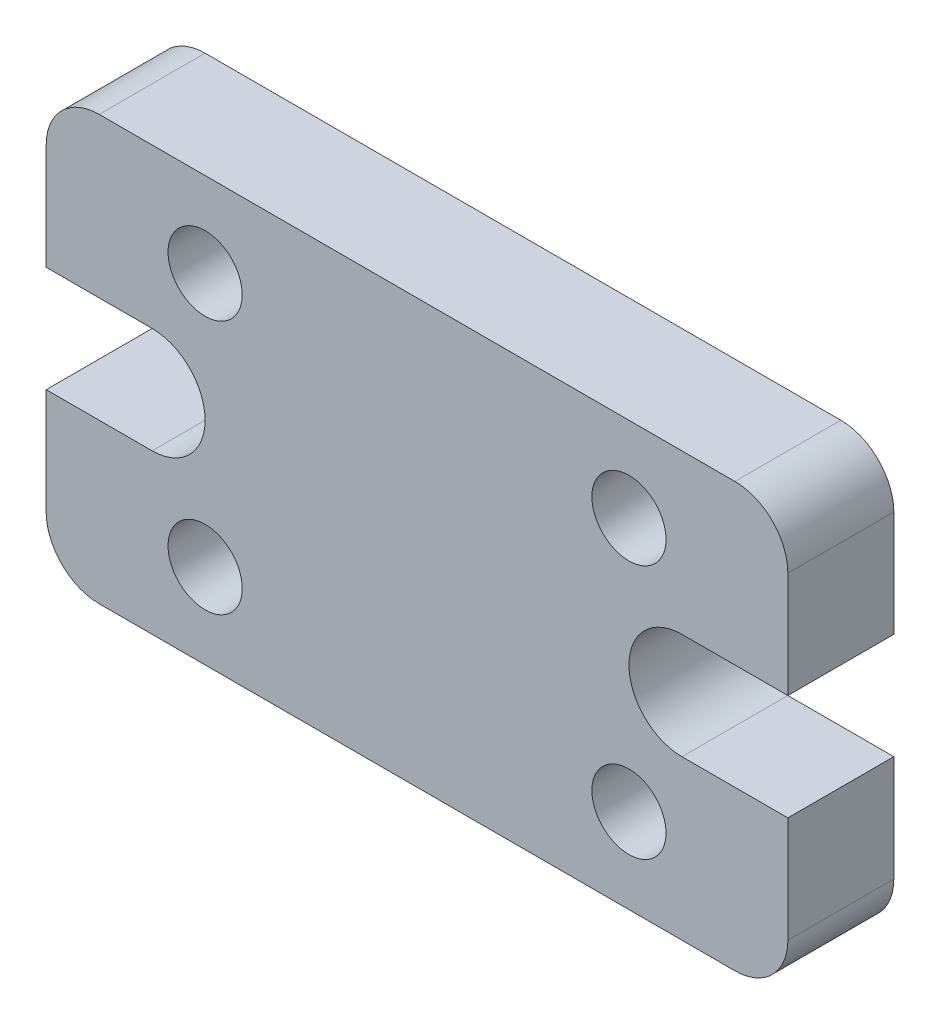
ISO-10303-21;
HEADER;
FILE_DESCRIPTION(('STEP AP214'),'2;1');
FILE_NAME('part.step','',(''),(''),'','','');
FILE_SCHEMA(('AUTOMOTIVE_DESIGN { 1 0 10303 214 1 1 1 1 }'));
ENDSEC;
DATA;
#1=APPLICATION_CONTEXT('core data for automotive mechanical design processes');
#2=APPLICATION_PROTOCOL_DEFINITION('international standard','automotive_design',2000,#1);
#3=PRODUCT_CONTEXT('',#1,'mechanical');
#4=PRODUCT('Part','Part','',(#3));
#5=PRODUCT_RELATED_PRODUCT_CATEGORY('part','',(#4));
#6=PRODUCT_DEFINITION_FORMATION('','',#4);
#7=PRODUCT_DEFINITION_CONTEXT('part definition',#1,'design');
#8=PRODUCT_DEFINITION('design','',#6,#7);
#9=PRODUCT_DEFINITION_SHAPE('','',#8);
#10=(LENGTH_UNIT() NAMED_UNIT(*) SI_UNIT(.MILLI.,.METRE.));
#11=(NAMED_UNIT(*) PLANE_ANGLE_UNIT() SI_UNIT($,.RADIAN.));
#12=(NAMED_UNIT(*) SI_UNIT($,.STERADIAN.) SOLID_ANGLE_UNIT());
#13=UNCERTAINTY_MEASURE_WITH_UNIT(LENGTH_MEASURE(1.E-05),#10,'distance_accuracy_value','');
#14=(GEOMETRIC_REPRESENTATION_CONTEXT(3) GLOBAL_UNCERTAINTY_ASSIGNED_CONTEXT((#13)) GLOBAL_UNIT_ASSIGNED_CONTEXT((#10,
#11,#12)) REPRESENTATION_CONTEXT('',''));
#15=CARTESIAN_POINT('',(0.,0.,0.));
#16=DIRECTION('',(0.,0.,1.));
#17=DIRECTION('',(1.,0.,0.));
#18=AXIS2_PLACEMENT_3D('',#15,#16,#17);
#19=CARTESIAN_POINT('',(30.,15.,10.));
#20=DIRECTION('',(0.,0.,-1.));
#21=DIRECTION('',(-1.,0.,0.));
#22=AXIS2_PLACEMENT_3D('',#19,#20,#21);
#23=PLANE('',#22);
#24=CARTESIAN_POINT('',(30.,15.,10.));
#25=DIRECTION('',(0.,0.,1.));
#26=DIRECTION('',(-1.,0.,0.));
#27=AXIS2_PLACEMENT_3D('',#24,#25,#26);
#28=CIRCLE('',#27,5.);
#29=CARTESIAN_POINT('',(35.,15.,10.));
#30=VERTEX_POINT('',#29);
#31=CARTESIAN_POINT('',(30.,20.,10.));
#32=VERTEX_POINT('',#31);
#33=EDGE_CURVE('E212',#30,#32,#28,.T.);
#34=ORIENTED_EDGE('',*,*,#33,.T.);
#35=DIRECTION('',(-1.,0.,0.));
#36=VECTOR('',#35,1.);
#37=CARTESIAN_POINT('',(-30.,20.,10.));
#38=LINE('',#37,#36);
#39=CARTESIAN_POINT('',(-30.,20.,10.));
#40=VERTEX_POINT('',#39);
#41=EDGE_CURVE('E120',#32,#40,#38,.T.);
#42=ORIENTED_EDGE('',*,*,#41,.T.);
#43=CARTESIAN_POINT('',(-30.,15.,10.));
#44=DIRECTION('',(0.,0.,1.));
#45=DIRECTION('',(1.,0.,0.));
#46=AXIS2_PLACEMENT_3D('',#43,#44,#45);
#47=CIRCLE('',#46,5.);
#48=CARTESIAN_POINT('',(-35.,15.,10.));
#49=VERTEX_POINT('',#48);
#50=EDGE_CURVE('E251',#40,#49,#47,.T.);
#51=ORIENTED_EDGE('',*,*,#50,.T.);
#52=DIRECTION('',(0.,-1.,0.));
#53=VECTOR('',#52,1.);
#54=CARTESIAN_POINT('',(-35.,15.,10.));
#55=LINE('',#54,#53);
#56=CARTESIAN_POINT('',(-35.,5.,10.));
#57=VERTEX_POINT('',#56);
#58=EDGE_CURVE('E270',#49,#57,#55,.T.);
#59=ORIENTED_EDGE('',*,*,#58,.T.);
#60=DIRECTION('',(1.,0.,0.));
#61=VECTOR('',#60,1.);
#62=CARTESIAN_POINT('',(-35.,5.,10.));
#63=LINE('',#62,#61);
#64=CARTESIAN_POINT('',(-25.,5.,10.));
#65=VERTEX_POINT('',#64);
#66=EDGE_CURVE('E267',#57,#65,#63,.T.);
#67=ORIENTED_EDGE('',*,*,#66,.T.);
#68=CARTESIAN_POINT('',(-25.,0.,10.));
#69=DIRECTION('',(0.,0.,-1.));
#70=DIRECTION('',(-1.,0.,0.));
#71=AXIS2_PLACEMENT_3D('',#68,#69,#70);
#72=CIRCLE('',#71,5.00000000000001);
#73=CARTESIAN_POINT('',(-25.,-5.00000000000001,10.));
#74=VERTEX_POINT('',#73);
#75=EDGE_CURVE('E269',#65,#74,#72,.T.);
#76=ORIENTED_EDGE('',*,*,#75,.T.);
#77=DIRECTION('',(-1.,0.,0.));
#78=VECTOR('',#77,1.);
#79=CARTESIAN_POINT('',(-35.,-5.00000000000001,10.));
#80=LINE('',#79,#78);
#81=CARTESIAN_POINT('',(-35.,-5.00000000000001,10.));
#82=VERTEX_POINT('',#81);
#83=EDGE_CURVE('E272',#74,#82,#80,.T.);
#84=ORIENTED_EDGE('',*,*,#83,.T.);
#85=DIRECTION('',(0.,-1.,0.));
#86=VECTOR('',#85,1.);
#87=CARTESIAN_POINT('',(-35.,-15.,10.));
#88=LINE('',#87,#86);
#89=CARTESIAN_POINT('',(-35.,-15.,10.));
#90=VERTEX_POINT('',#89);
#91=EDGE_CURVE('E278',#82,#90,#88,.T.);
#92=ORIENTED_EDGE('',*,*,#91,.T.);
#93=CARTESIAN_POINT('',(-30.,-15.,10.));
#94=DIRECTION('',(0.,0.,1.));
#95=DIRECTION('',(-1.,0.,0.));
#96=AXIS2_PLACEMENT_3D('',#93,#94,#95);
#97=CIRCLE('',#96,5.);
#98=CARTESIAN_POINT('',(-30.,-20.,10.));
#99=VERTEX_POINT('',#98);
#100=EDGE_CURVE('E280',#90,#99,#97,.T.);
#101=ORIENTED_EDGE('',*,*,#100,.T.);
#102=DIRECTION('',(1.,0.,0.));
#103=VECTOR('',#102,1.);
#104=CARTESIAN_POINT('',(-30.,-20.,10.));
#105=LINE('',#104,#103);
#106=CARTESIAN_POINT('',(30.,-20.,10.));
#107=VERTEX_POINT('',#106);
#108=EDGE_CURVE('E282',#99,#107,#105,.T.);
#109=ORIENTED_EDGE('',*,*,#108,.T.);
#110=CARTESIAN_POINT('',(30.,-15.,10.));
#111=DIRECTION('',(0.,0.,1.));
#112=DIRECTION('',(1.,0.,0.));
#113=AXIS2_PLACEMENT_3D('',#110,#111,#112);
#114=CIRCLE('',#113,5.);
#115=CARTESIAN_POINT('',(35.,-15.,10.));
#116=VERTEX_POINT('',#115);
#117=EDGE_CURVE('E284',#107,#116,#114,.T.);
#118=ORIENTED_EDGE('',*,*,#117,.T.);
#119=DIRECTION('',(0.,1.,0.));
#120=VECTOR('',#119,1.);
#121=CARTESIAN_POINT('',(35.,-15.,10.));
#122=LINE('',#121,#120);
#123=CARTESIAN_POINT('',(35.,-5.,10.));
#124=VERTEX_POINT('',#123);
#125=EDGE_CURVE('E286',#116,#124,#122,.T.);
#126=ORIENTED_EDGE('',*,*,#125,.T.);
#127=DIRECTION('',(-1.,0.,0.));
#128=VECTOR('',#127,1.);
#129=CARTESIAN_POINT('',(35.,-5.,10.));
#130=LINE('',#129,#128);
#131=CARTESIAN_POINT('',(25.,-5.00000000000001,10.));
#132=VERTEX_POINT('',#131);
#133=EDGE_CURVE('E163',#124,#132,#130,.T.);
#134=ORIENTED_EDGE('',*,*,#133,.T.);
#135=CARTESIAN_POINT('',(25.,0.,10.));
#136=DIRECTION('',(0.,0.,-1.));
#137=DIRECTION('',(1.,0.,0.));
#138=AXIS2_PLACEMENT_3D('',#135,#136,#137);
#139=CIRCLE('',#138,5.00000000000001);
#140=CARTESIAN_POINT('',(25.,5.00000000000001,10.));
#141=VERTEX_POINT('',#140);
#142=EDGE_CURVE('E157',#132,#141,#139,.T.);
#143=ORIENTED_EDGE('',*,*,#142,.T.);
#144=DIRECTION('',(1.,0.,0.));
#145=VECTOR('',#144,1.);
#146=CARTESIAN_POINT('',(35.,5.,10.));
#147=LINE('',#146,#145);
#148=CARTESIAN_POINT('',(35.,5.,10.));
#149=VERTEX_POINT('',#148);
#150=EDGE_CURVE('E161',#141,#149,#147,.T.);
#151=ORIENTED_EDGE('',*,*,#150,.T.);
#152=DIRECTION('',(0.,1.,0.));
#153=VECTOR('',#152,1.);
#154=CARTESIAN_POINT('',(35.,15.,10.));
#155=LINE('',#154,#153);
#156=EDGE_CURVE('E53',#149,#30,#155,.T.);
#157=ORIENTED_EDGE('',*,*,#156,.T.);
#158=EDGE_LOOP('',(#34,#42,#51,#59,#67,#76,#84,#92,#101,#109,#118,#126,#134,#143,#151,#157));
#159=FACE_BOUND('',#158,.T.);
#160=CARTESIAN_POINT('',(20.,12.,10.));
#161=DIRECTION('',(0.,0.,1.));
#162=DIRECTION('',(1.,0.,0.));
#163=AXIS2_PLACEMENT_3D('',#160,#161,#162);
#164=CIRCLE('',#163,3.5);
#165=CARTESIAN_POINT('',(23.5,12.,10.));
#166=VERTEX_POINT('',#165);
#167=EDGE_CURVE('E185',#166,#166,#164,.T.);
#168=ORIENTED_EDGE('',*,*,#167,.F.);
#169=EDGE_LOOP('',(#168));
#170=FACE_BOUND('',#169,.T.);
#171=CARTESIAN_POINT('',(20.,-12.,10.));
#172=DIRECTION('',(0.,0.,1.));
#173=DIRECTION('',(-1.,0.,0.));
#174=AXIS2_PLACEMENT_3D('',#171,#172,#173);
#175=CIRCLE('',#174,3.5);
#176=CARTESIAN_POINT('',(16.5,-12.,10.));
#177=VERTEX_POINT('',#176);
#178=EDGE_CURVE('E350',#177,#177,#175,.T.);
#179=ORIENTED_EDGE('',*,*,#178,.F.);
#180=EDGE_LOOP('',(#179));
#181=FACE_BOUND('',#180,.T.);
#182=CARTESIAN_POINT('',(-20.,-12.,10.));
#183=DIRECTION('',(0.,0.,1.));
#184=DIRECTION('',(1.,0.,0.));
#185=AXIS2_PLACEMENT_3D('',#182,#183,#184);
#186=CIRCLE('',#185,3.5);
#187=CARTESIAN_POINT('',(-16.5,-12.,10.));
#188=VERTEX_POINT('',#187);
#189=EDGE_CURVE('E344',#188,#188,#186,.T.);
#190=ORIENTED_EDGE('',*,*,#189,.F.);
#191=EDGE_LOOP('',(#190));
#192=FACE_BOUND('',#191,.T.);
#193=CARTESIAN_POINT('',(-20.,12.,10.));
#194=DIRECTION('',(0.,0.,1.));
#195=DIRECTION('',(-1.,0.,0.));
#196=AXIS2_PLACEMENT_3D('',#193,#194,#195);
#197=CIRCLE('',#196,3.5);
#198=CARTESIAN_POINT('',(-23.5,12.,10.));
#199=VERTEX_POINT('',#198);
#200=EDGE_CURVE('E335',#199,#199,#197,.T.);
#201=ORIENTED_EDGE('',*,*,#200,.F.);
#202=EDGE_LOOP('',(#201));
#203=FACE_BOUND('',#202,.T.);
#204=ADVANCED_FACE('F36',(#159,#170,#181,#192,#203),#23,.F.);
#205=CARTESIAN_POINT('',(30.,15.,0.));
#206=DIRECTION('',(0.,0.,-1.));
#207=DIRECTION('',(-1.,0.,0.));
#208=AXIS2_PLACEMENT_3D('',#205,#206,#207);
#209=PLANE('',#208);
#210=CARTESIAN_POINT('',(-20.,-12.,0.));
#211=DIRECTION('',(0.,0.,1.));
#212=DIRECTION('',(1.,0.,0.));
#213=AXIS2_PLACEMENT_3D('',#210,#211,#212);
#214=CIRCLE('',#213,3.5);
#215=CARTESIAN_POINT('',(-16.5,-12.,0.));
#216=VERTEX_POINT('',#215);
#217=EDGE_CURVE('E341',#216,#216,#214,.T.);
#218=ORIENTED_EDGE('',*,*,#217,.T.);
#219=EDGE_LOOP('',(#218));
#220=FACE_BOUND('',#219,.T.);
#221=CARTESIAN_POINT('',(20.,12.,0.));
#222=DIRECTION('',(0.,0.,1.));
#223=DIRECTION('',(1.,0.,0.));
#224=AXIS2_PLACEMENT_3D('',#221,#222,#223);
#225=CIRCLE('',#224,3.5);
#226=CARTESIAN_POINT('',(23.5,12.,0.));
#227=VERTEX_POINT('',#226);
#228=EDGE_CURVE('E353',#227,#227,#225,.T.);
#229=ORIENTED_EDGE('',*,*,#228,.T.);
#230=EDGE_LOOP('',(#229));
#231=FACE_BOUND('',#230,.T.);
#232=CARTESIAN_POINT('',(30.,15.,0.));
#233=DIRECTION('',(0.,0.,1.));
#234=DIRECTION('',(-1.,0.,0.));
#235=AXIS2_PLACEMENT_3D('',#232,#233,#234);
#236=CIRCLE('',#235,5.);
#237=CARTESIAN_POINT('',(35.,15.,0.));
#238=VERTEX_POINT('',#237);
#239=CARTESIAN_POINT('',(30.,20.,0.));
#240=VERTEX_POINT('',#239);
#241=EDGE_CURVE('E181',#238,#240,#236,.T.);
#242=ORIENTED_EDGE('',*,*,#241,.F.);
#243=DIRECTION('',(0.,1.,0.));
#244=VECTOR('',#243,1.);
#245=CARTESIAN_POINT('',(35.,15.,0.));
#246=LINE('',#245,#244);
#247=CARTESIAN_POINT('',(35.,5.,0.));
#248=VERTEX_POINT('',#247);
#249=EDGE_CURVE('E112',#248,#238,#246,.T.);
#250=ORIENTED_EDGE('',*,*,#249,.F.);
#251=DIRECTION('',(1.,0.,0.));
#252=VECTOR('',#251,1.);
#253=CARTESIAN_POINT('',(35.,5.,0.));
#254=LINE('',#253,#252);
#255=CARTESIAN_POINT('',(25.,5.00000000000001,0.));
#256=VERTEX_POINT('',#255);
#257=EDGE_CURVE('E106',#256,#248,#254,.T.);
#258=ORIENTED_EDGE('',*,*,#257,.F.);
#259=CARTESIAN_POINT('',(25.,0.,0.));
#260=DIRECTION('',(0.,0.,-1.));
#261=DIRECTION('',(1.,0.,0.));
#262=AXIS2_PLACEMENT_3D('',#259,#260,#261);
#263=CIRCLE('',#262,5.00000000000001);
#264=CARTESIAN_POINT('',(25.,-5.00000000000001,0.));
#265=VERTEX_POINT('',#264);
#266=EDGE_CURVE('E171',#265,#256,#263,.T.);
#267=ORIENTED_EDGE('',*,*,#266,.F.);
#268=DIRECTION('',(-1.,0.,0.));
#269=VECTOR('',#268,1.);
#270=CARTESIAN_POINT('',(35.,-5.,0.));
#271=LINE('',#270,#269);
#272=CARTESIAN_POINT('',(35.,-5.,0.));
#273=VERTEX_POINT('',#272);
#274=EDGE_CURVE('E207',#273,#265,#271,.T.);
#275=ORIENTED_EDGE('',*,*,#274,.F.);
#276=DIRECTION('',(0.,1.,0.));
#277=VECTOR('',#276,1.);
#278=CARTESIAN_POINT('',(35.,-15.,0.));
#279=LINE('',#278,#277);
#280=CARTESIAN_POINT('',(35.,-15.,0.));
#281=VERTEX_POINT('',#280);
#282=EDGE_CURVE('E205',#281,#273,#279,.T.);
#283=ORIENTED_EDGE('',*,*,#282,.F.);
#284=CARTESIAN_POINT('',(30.,-15.,0.));
#285=DIRECTION('',(0.,0.,1.));
#286=DIRECTION('',(1.,0.,0.));
#287=AXIS2_PLACEMENT_3D('',#284,#285,#286);
#288=CIRCLE('',#287,5.);
#289=CARTESIAN_POINT('',(30.,-20.,0.));
#290=VERTEX_POINT('',#289);
#291=EDGE_CURVE('E203',#290,#281,#288,.T.);
#292=ORIENTED_EDGE('',*,*,#291,.F.);
#293=DIRECTION('',(1.,0.,0.));
#294=VECTOR('',#293,1.);
#295=CARTESIAN_POINT('',(-30.,-20.,0.));
#296=LINE('',#295,#294);
#297=CARTESIAN_POINT('',(-30.,-20.,0.));
#298=VERTEX_POINT('',#297);
#299=EDGE_CURVE('E201',#298,#290,#296,.T.);
#300=ORIENTED_EDGE('',*,*,#299,.F.);
#301=CARTESIAN_POINT('',(-30.,-15.,0.));
#302=DIRECTION('',(0.,0.,1.));
#303=DIRECTION('',(-1.,0.,0.));
#304=AXIS2_PLACEMENT_3D('',#301,#302,#303);
#305=CIRCLE('',#304,5.);
#306=CARTESIAN_POINT('',(-35.,-15.,0.));
#307=VERTEX_POINT('',#306);
#308=EDGE_CURVE('E199',#307,#298,#305,.T.);
#309=ORIENTED_EDGE('',*,*,#308,.F.);
#310=DIRECTION('',(0.,-1.,0.));
#311=VECTOR('',#310,1.);
#312=CARTESIAN_POINT('',(-35.,-15.,0.));
#313=LINE('',#312,#311);
#314=CARTESIAN_POINT('',(-35.,-5.00000000000001,0.));
#315=VERTEX_POINT('',#314);
#316=EDGE_CURVE('E197',#315,#307,#313,.T.);
#317=ORIENTED_EDGE('',*,*,#316,.F.);
#318=DIRECTION('',(-1.,0.,0.));
#319=VECTOR('',#318,1.);
#320=CARTESIAN_POINT('',(-35.,-5.00000000000001,0.));
#321=LINE('',#320,#319);
#322=CARTESIAN_POINT('',(-25.,-5.00000000000001,0.));
#323=VERTEX_POINT('',#322);
#324=EDGE_CURVE('E195',#323,#315,#321,.T.);
#325=ORIENTED_EDGE('',*,*,#324,.F.);
#326=CARTESIAN_POINT('',(-25.,0.,0.));
#327=DIRECTION('',(0.,0.,-1.));
#328=DIRECTION('',(-1.,0.,0.));
#329=AXIS2_PLACEMENT_3D('',#326,#327,#328);
#330=CIRCLE('',#329,5.00000000000001);
#331=CARTESIAN_POINT('',(-25.,5.,0.));
#332=VERTEX_POINT('',#331);
#333=EDGE_CURVE('E193',#332,#323,#330,.T.);
#334=ORIENTED_EDGE('',*,*,#333,.F.);
#335=DIRECTION('',(1.,0.,0.));
#336=VECTOR('',#335,1.);
#337=CARTESIAN_POINT('',(-35.,5.,0.));
#338=LINE('',#337,#336);
#339=CARTESIAN_POINT('',(-35.,5.,0.));
#340=VERTEX_POINT('',#339);
#341=EDGE_CURVE('E191',#340,#332,#338,.T.);
#342=ORIENTED_EDGE('',*,*,#341,.F.);
#343=DIRECTION('',(0.,-1.,0.));
#344=VECTOR('',#343,1.);
#345=CARTESIAN_POINT('',(-35.,15.,0.));
#346=LINE('',#345,#344);
#347=CARTESIAN_POINT('',(-35.,15.,0.));
#348=VERTEX_POINT('',#347);
#349=EDGE_CURVE('E189',#348,#340,#346,.T.);
#350=ORIENTED_EDGE('',*,*,#349,.F.);
#351=CARTESIAN_POINT('',(-30.,15.,0.));
#352=DIRECTION('',(0.,0.,1.));
#353=DIRECTION('',(1.,0.,0.));
#354=AXIS2_PLACEMENT_3D('',#351,#352,#353);
#355=CIRCLE('',#354,5.);
#356=CARTESIAN_POINT('',(-30.,20.,0.));
#357=VERTEX_POINT('',#356);
#358=EDGE_CURVE('E187',#357,#348,#355,.T.);
#359=ORIENTED_EDGE('',*,*,#358,.F.);
#360=DIRECTION('',(-1.,0.,0.));
#361=VECTOR('',#360,1.);
#362=CARTESIAN_POINT('',(-30.,20.,0.));
#363=LINE('',#362,#361);
#364=EDGE_CURVE('E184',#240,#357,#363,.T.);
#365=ORIENTED_EDGE('',*,*,#364,.F.);
#366=EDGE_LOOP('',(#242,#250,#258,#267,#275,#283,#292,#300,#309,#317,#325,#334,#342,#350,#359,#365));
#367=FACE_BOUND('',#366,.T.);
#368=CARTESIAN_POINT('',(20.,-12.,0.));
#369=DIRECTION('',(0.,0.,1.));
#370=DIRECTION('',(-1.,0.,0.));
#371=AXIS2_PLACEMENT_3D('',#368,#369,#370);
#372=CIRCLE('',#371,3.5);
#373=CARTESIAN_POINT('',(16.5,-12.,0.));
#374=VERTEX_POINT('',#373);
#375=EDGE_CURVE('E347',#374,#374,#372,.T.);
#376=ORIENTED_EDGE('',*,*,#375,.T.);
#377=EDGE_LOOP('',(#376));
#378=FACE_BOUND('',#377,.T.);
#379=CARTESIAN_POINT('',(-20.,12.,0.));
#380=DIRECTION('',(0.,0.,1.));
#381=DIRECTION('',(-1.,0.,0.));
#382=AXIS2_PLACEMENT_3D('',#379,#380,#381);
#383=CIRCLE('',#382,3.5);
#384=CARTESIAN_POINT('',(-23.5,12.,0.));
#385=VERTEX_POINT('',#384);
#386=EDGE_CURVE('E338',#385,#385,#383,.T.);
#387=ORIENTED_EDGE('',*,*,#386,.T.);
#388=EDGE_LOOP('',(#387));
#389=FACE_BOUND('',#388,.T.);
#390=ADVANCED_FACE('F255',(#220,#231,#367,#378,#389),#209,.T.);
#391=CARTESIAN_POINT('',(30.,15.,10.));
#392=DIRECTION('',(0.,0.,-1.));
#393=DIRECTION('',(-1.,0.,0.));
#394=AXIS2_PLACEMENT_3D('',#391,#392,#393);
#395=CYLINDRICAL_SURFACE('',#394,5.);
#396=ORIENTED_EDGE('',*,*,#241,.T.);
#397=DIRECTION('',(0.,0.,-1.));
#398=VECTOR('',#397,1.);
#399=CARTESIAN_POINT('',(30.,20.,10.));
#400=LINE('',#399,#398);
#401=EDGE_CURVE('E11',#32,#240,#400,.T.);
#402=ORIENTED_EDGE('',*,*,#401,.F.);
#403=ORIENTED_EDGE('',*,*,#33,.F.);
#404=DIRECTION('',(0.,0.,-1.));
#405=VECTOR('',#404,1.);
#406=CARTESIAN_POINT('',(35.,15.,10.));
#407=LINE('',#406,#405);
#408=EDGE_CURVE('E177',#30,#238,#407,.T.);
#409=ORIENTED_EDGE('',*,*,#408,.T.);
#410=EDGE_LOOP('',(#396,#402,#403,#409));
#411=FACE_BOUND('',#410,.T.);
#412=ADVANCED_FACE('F38',(#411),#395,.T.);
#413=CARTESIAN_POINT('',(-30.,20.,10.));
#414=DIRECTION('',(0.,-1.,0.));
#415=DIRECTION('',(1.,0.,0.));
#416=AXIS2_PLACEMENT_3D('',#413,#414,#415);
#417=PLANE('',#416);
#418=ORIENTED_EDGE('',*,*,#364,.T.);
#419=DIRECTION('',(0.,0.,-1.));
#420=VECTOR('',#419,1.);
#421=CARTESIAN_POINT('',(-30.,20.,10.));
#422=LINE('',#421,#420);
#423=EDGE_CURVE('E45',#40,#357,#422,.T.);
#424=ORIENTED_EDGE('',*,*,#423,.F.);
#425=ORIENTED_EDGE('',*,*,#41,.F.);
#426=ORIENTED_EDGE('',*,*,#401,.T.);
#427=EDGE_LOOP('',(#418,#424,#425,#426));
#428=FACE_BOUND('',#427,.T.);
#429=ADVANCED_FACE('F505',(#428),#417,.F.);
#430=CARTESIAN_POINT('',(-30.,15.,10.));
#431=DIRECTION('',(0.,0.,-1.));
#432=DIRECTION('',(-1.,0.,0.));
#433=AXIS2_PLACEMENT_3D('',#430,#431,#432);
#434=CYLINDRICAL_SURFACE('',#433,5.);
#435=ORIENTED_EDGE('',*,*,#358,.T.);
#436=DIRECTION('',(0.,0.,-1.));
#437=VECTOR('',#436,1.);
#438=CARTESIAN_POINT('',(-35.,15.,10.));
#439=LINE('',#438,#437);
#440=EDGE_CURVE('E243',#49,#348,#439,.T.);
#441=ORIENTED_EDGE('',*,*,#440,.F.);
#442=ORIENTED_EDGE('',*,*,#50,.F.);
#443=ORIENTED_EDGE('',*,*,#423,.T.);
#444=EDGE_LOOP('',(#435,#441,#442,#443));
#445=FACE_BOUND('',#444,.T.);
#446=ADVANCED_FACE('F249',(#445),#434,.T.);
#447=CARTESIAN_POINT('',(-35.,15.,10.));
#448=DIRECTION('',(1.,0.,0.));
#449=DIRECTION('',(0.,1.,0.));
#450=AXIS2_PLACEMENT_3D('',#447,#448,#449);
#451=PLANE('',#450);
#452=ORIENTED_EDGE('',*,*,#349,.T.);
#453=DIRECTION('',(0.,0.,-1.));
#454=VECTOR('',#453,1.);
#455=CARTESIAN_POINT('',(-35.,5.,10.));
#456=LINE('',#455,#454);
#457=EDGE_CURVE('E240',#57,#340,#456,.T.);
#458=ORIENTED_EDGE('',*,*,#457,.F.);
#459=ORIENTED_EDGE('',*,*,#58,.F.);
#460=ORIENTED_EDGE('',*,*,#440,.T.);
#461=EDGE_LOOP('',(#452,#458,#459,#460));
#462=FACE_BOUND('',#461,.T.);
#463=ADVANCED_FACE('F261',(#462),#451,.F.);
#464=CARTESIAN_POINT('',(-35.,5.,10.));
#465=DIRECTION('',(0.,1.,0.));
#466=DIRECTION('',(-1.,0.,0.));
#467=AXIS2_PLACEMENT_3D('',#464,#465,#466);
#468=PLANE('',#467);
#469=ORIENTED_EDGE('',*,*,#341,.T.);
#470=DIRECTION('',(0.,0.,-1.));
#471=VECTOR('',#470,1.);
#472=CARTESIAN_POINT('',(-25.,5.,10.));
#473=LINE('',#472,#471);
#474=EDGE_CURVE('E237',#65,#332,#473,.T.);
#475=ORIENTED_EDGE('',*,*,#474,.F.);
#476=ORIENTED_EDGE('',*,*,#66,.F.);
#477=ORIENTED_EDGE('',*,*,#457,.T.);
#478=EDGE_LOOP('',(#469,#475,#476,#477));
#479=FACE_BOUND('',#478,.T.);
#480=ADVANCED_FACE('F265',(#479),#468,.F.);
#481=CARTESIAN_POINT('',(-25.,0.,10.));
#482=DIRECTION('',(0.,0.,-1.));
#483=DIRECTION('',(-1.,0.,0.));
#484=AXIS2_PLACEMENT_3D('',#481,#482,#483);
#485=CYLINDRICAL_SURFACE('',#484,5.00000000000001);
#486=ORIENTED_EDGE('',*,*,#333,.T.);
#487=DIRECTION('',(0.,0.,-1.));
#488=VECTOR('',#487,1.);
#489=CARTESIAN_POINT('',(-25.,-5.00000000000001,10.));
#490=LINE('',#489,#488);
#491=EDGE_CURVE('E234',#74,#323,#490,.T.);
#492=ORIENTED_EDGE('',*,*,#491,.F.);
#493=ORIENTED_EDGE('',*,*,#75,.F.);
#494=ORIENTED_EDGE('',*,*,#474,.T.);
#495=EDGE_LOOP('',(#486,#492,#493,#494));
#496=FACE_BOUND('',#495,.T.);
#497=ADVANCED_FACE('F470',(#496),#485,.F.);
#498=CARTESIAN_POINT('',(-35.,-5.00000000000001,10.));
#499=DIRECTION('',(0.,-1.,0.));
#500=DIRECTION('',(1.,0.,0.));
#501=AXIS2_PLACEMENT_3D('',#498,#499,#500);
#502=PLANE('',#501);
#503=ORIENTED_EDGE('',*,*,#324,.T.);
#504=DIRECTION('',(0.,0.,-1.));
#505=VECTOR('',#504,1.);
#506=CARTESIAN_POINT('',(-35.,-5.00000000000001,10.));
#507=LINE('',#506,#505);
#508=EDGE_CURVE('E231',#82,#315,#507,.T.);
#509=ORIENTED_EDGE('',*,*,#508,.F.);
#510=ORIENTED_EDGE('',*,*,#83,.F.);
#511=ORIENTED_EDGE('',*,*,#491,.T.);
#512=EDGE_LOOP('',(#503,#509,#510,#511));
#513=FACE_BOUND('',#512,.T.);
#514=ADVANCED_FACE('F460',(#513),#502,.F.);
#515=CARTESIAN_POINT('',(-35.,-15.,10.));
#516=DIRECTION('',(1.,0.,0.));
#517=DIRECTION('',(0.,1.,0.));
#518=AXIS2_PLACEMENT_3D('',#515,#516,#517);
#519=PLANE('',#518);
#520=ORIENTED_EDGE('',*,*,#316,.T.);
#521=DIRECTION('',(0.,0.,-1.));
#522=VECTOR('',#521,1.);
#523=CARTESIAN_POINT('',(-35.,-15.,10.));
#524=LINE('',#523,#522);
#525=EDGE_CURVE('E228',#90,#307,#524,.T.);
#526=ORIENTED_EDGE('',*,*,#525,.F.);
#527=ORIENTED_EDGE('',*,*,#91,.F.);
#528=ORIENTED_EDGE('',*,*,#508,.T.);
#529=EDGE_LOOP('',(#520,#526,#527,#528));
#530=FACE_BOUND('',#529,.T.);
#531=ADVANCED_FACE('F450',(#530),#519,.F.);
#532=CARTESIAN_POINT('',(-30.,-15.,10.));
#533=DIRECTION('',(0.,0.,-1.));
#534=DIRECTION('',(-1.,0.,0.));
#535=AXIS2_PLACEMENT_3D('',#532,#533,#534);
#536=CYLINDRICAL_SURFACE('',#535,5.);
#537=ORIENTED_EDGE('',*,*,#308,.T.);
#538=DIRECTION('',(0.,0.,-1.));
#539=VECTOR('',#538,1.);
#540=CARTESIAN_POINT('',(-30.,-20.,10.));
#541=LINE('',#540,#539);
#542=EDGE_CURVE('E225',#99,#298,#541,.T.);
#543=ORIENTED_EDGE('',*,*,#542,.F.);
#544=ORIENTED_EDGE('',*,*,#100,.F.);
#545=ORIENTED_EDGE('',*,*,#525,.T.);
#546=EDGE_LOOP('',(#537,#543,#544,#545));
#547=FACE_BOUND('',#546,.T.);
#548=ADVANCED_FACE('F440',(#547),#536,.T.);
#549=CARTESIAN_POINT('',(-30.,-20.,10.));
#550=DIRECTION('',(0.,1.,0.));
#551=DIRECTION('',(-1.,0.,0.));
#552=AXIS2_PLACEMENT_3D('',#549,#550,#551);
#553=PLANE('',#552);
#554=ORIENTED_EDGE('',*,*,#299,.T.);
#555=DIRECTION('',(0.,0.,-1.));
#556=VECTOR('',#555,1.);
#557=CARTESIAN_POINT('',(30.,-20.,10.));
#558=LINE('',#557,#556);
#559=EDGE_CURVE('E222',#107,#290,#558,.T.);
#560=ORIENTED_EDGE('',*,*,#559,.F.);
#561=ORIENTED_EDGE('',*,*,#108,.F.);
#562=ORIENTED_EDGE('',*,*,#542,.T.);
#563=EDGE_LOOP('',(#554,#560,#561,#562));
#564=FACE_BOUND('',#563,.T.);
#565=ADVANCED_FACE('F430',(#564),#553,.F.);
#566=CARTESIAN_POINT('',(30.,-15.,10.));
#567=DIRECTION('',(0.,0.,-1.));
#568=DIRECTION('',(-1.,0.,0.));
#569=AXIS2_PLACEMENT_3D('',#566,#567,#568);
#570=CYLINDRICAL_SURFACE('',#569,5.);
#571=ORIENTED_EDGE('',*,*,#291,.T.);
#572=DIRECTION('',(0.,0.,-1.));
#573=VECTOR('',#572,1.);
#574=CARTESIAN_POINT('',(35.,-15.,10.));
#575=LINE('',#574,#573);
#576=EDGE_CURVE('E219',#116,#281,#575,.T.);
#577=ORIENTED_EDGE('',*,*,#576,.F.);
#578=ORIENTED_EDGE('',*,*,#117,.F.);
#579=ORIENTED_EDGE('',*,*,#559,.T.);
#580=EDGE_LOOP('',(#571,#577,#578,#579));
#581=FACE_BOUND('',#580,.T.);
#582=ADVANCED_FACE('F421',(#581),#570,.T.);
#583=CARTESIAN_POINT('',(35.,-15.,10.));
#584=DIRECTION('',(-1.,0.,0.));
#585=DIRECTION('',(0.,-1.,0.));
#586=AXIS2_PLACEMENT_3D('',#583,#584,#585);
#587=PLANE('',#586);
#588=ORIENTED_EDGE('',*,*,#282,.T.);
#589=DIRECTION('',(0.,0.,-1.));
#590=VECTOR('',#589,1.);
#591=CARTESIAN_POINT('',(35.,-5.,10.));
#592=LINE('',#591,#590);
#593=EDGE_CURVE('E216',#124,#273,#592,.T.);
#594=ORIENTED_EDGE('',*,*,#593,.F.);
#595=ORIENTED_EDGE('',*,*,#125,.F.);
#596=ORIENTED_EDGE('',*,*,#576,.T.);
#597=EDGE_LOOP('',(#588,#594,#595,#596));
#598=FACE_BOUND('',#597,.T.);
#599=ADVANCED_FACE('F292',(#598),#587,.F.);
#600=CARTESIAN_POINT('',(35.,-5.,10.));
#601=DIRECTION('',(0.,-1.,0.));
#602=DIRECTION('',(1.,0.,0.));
#603=AXIS2_PLACEMENT_3D('',#600,#601,#602);
#604=PLANE('',#603);
#605=ORIENTED_EDGE('',*,*,#274,.T.);
#606=DIRECTION('',(0.,0.,-1.));
#607=VECTOR('',#606,1.);
#608=CARTESIAN_POINT('',(25.,-5.00000000000001,10.));
#609=LINE('',#608,#607);
#610=EDGE_CURVE('E172',#132,#265,#609,.T.);
#611=ORIENTED_EDGE('',*,*,#610,.F.);
#612=ORIENTED_EDGE('',*,*,#133,.F.);
#613=ORIENTED_EDGE('',*,*,#593,.T.);
#614=EDGE_LOOP('',(#605,#611,#612,#613));
#615=FACE_BOUND('',#614,.T.);
#616=ADVANCED_FACE('F296',(#615),#604,.F.);
#617=CARTESIAN_POINT('',(25.,0.,10.));
#618=DIRECTION('',(0.,0.,-1.));
#619=DIRECTION('',(-1.,0.,0.));
#620=AXIS2_PLACEMENT_3D('',#617,#618,#619);
#621=CYLINDRICAL_SURFACE('',#620,5.00000000000001);
#622=ORIENTED_EDGE('',*,*,#266,.T.);
#623=DIRECTION('',(0.,0.,-1.));
#624=VECTOR('',#623,1.);
#625=CARTESIAN_POINT('',(25.,5.00000000000001,10.));
#626=LINE('',#625,#624);
#627=EDGE_CURVE('E168',#141,#256,#626,.T.);
#628=ORIENTED_EDGE('',*,*,#627,.F.);
#629=ORIENTED_EDGE('',*,*,#142,.F.);
#630=ORIENTED_EDGE('',*,*,#610,.T.);
#631=EDGE_LOOP('',(#622,#628,#629,#630));
#632=FACE_BOUND('',#631,.T.);
#633=ADVANCED_FACE('F169',(#632),#621,.F.);
#634=CARTESIAN_POINT('',(35.,5.,10.));
#635=DIRECTION('',(0.,1.,0.));
#636=DIRECTION('',(-1.,0.,0.));
#637=AXIS2_PLACEMENT_3D('',#634,#635,#636);
#638=PLANE('',#637);
#639=ORIENTED_EDGE('',*,*,#257,.T.);
#640=DIRECTION('',(0.,0.,-1.));
#641=VECTOR('',#640,1.);
#642=CARTESIAN_POINT('',(35.,5.,10.));
#643=LINE('',#642,#641);
#644=EDGE_CURVE('E173',#149,#248,#643,.T.);
#645=ORIENTED_EDGE('',*,*,#644,.F.);
#646=ORIENTED_EDGE('',*,*,#150,.F.);
#647=ORIENTED_EDGE('',*,*,#627,.T.);
#648=EDGE_LOOP('',(#639,#645,#646,#647));
#649=FACE_BOUND('',#648,.T.);
#650=ADVANCED_FACE('F175',(#649),#638,.F.);
#651=CARTESIAN_POINT('',(35.,15.,10.));
#652=DIRECTION('',(-1.,0.,0.));
#653=DIRECTION('',(0.,-1.,0.));
#654=AXIS2_PLACEMENT_3D('',#651,#652,#653);
#655=PLANE('',#654);
#656=ORIENTED_EDGE('',*,*,#249,.T.);
#657=ORIENTED_EDGE('',*,*,#408,.F.);
#658=ORIENTED_EDGE('',*,*,#156,.F.);
#659=ORIENTED_EDGE('',*,*,#644,.T.);
#660=EDGE_LOOP('',(#656,#657,#658,#659));
#661=FACE_BOUND('',#660,.T.);
#662=ADVANCED_FACE('F300',(#661),#655,.F.);
#663=CARTESIAN_POINT('',(20.,12.,10.));
#664=DIRECTION('',(0.,0.,-1.));
#665=DIRECTION('',(-1.,0.,0.));
#666=AXIS2_PLACEMENT_3D('',#663,#664,#665);
#667=CYLINDRICAL_SURFACE('',#666,3.5);
#668=ORIENTED_EDGE('',*,*,#167,.T.);
#669=EDGE_LOOP('',(#668));
#670=FACE_BOUND('',#669,.T.);
#671=ORIENTED_EDGE('',*,*,#228,.F.);
#672=EDGE_LOOP('',(#671));
#673=FACE_BOUND('',#672,.T.);
#674=ADVANCED_FACE('F302',(#670,#673),#667,.F.);
#675=CARTESIAN_POINT('',(20.,-12.,10.));
#676=DIRECTION('',(0.,0.,-1.));
#677=DIRECTION('',(-1.,0.,0.));
#678=AXIS2_PLACEMENT_3D('',#675,#676,#677);
#679=CYLINDRICAL_SURFACE('',#678,3.5);
#680=ORIENTED_EDGE('',*,*,#178,.T.);
#681=EDGE_LOOP('',(#680));
#682=FACE_BOUND('',#681,.T.);
#683=ORIENTED_EDGE('',*,*,#375,.F.);
#684=EDGE_LOOP('',(#683));
#685=FACE_BOUND('',#684,.T.);
#686=ADVANCED_FACE('F308',(#682,#685),#679,.F.);
#687=CARTESIAN_POINT('',(-20.,-12.,10.));
#688=DIRECTION('',(0.,0.,-1.));
#689=DIRECTION('',(-1.,0.,0.));
#690=AXIS2_PLACEMENT_3D('',#687,#688,#689);
#691=CYLINDRICAL_SURFACE('',#690,3.5);
#692=ORIENTED_EDGE('',*,*,#189,.T.);
#693=EDGE_LOOP('',(#692));
#694=FACE_BOUND('',#693,.T.);
#695=ORIENTED_EDGE('',*,*,#217,.F.);
#696=EDGE_LOOP('',(#695));
#697=FACE_BOUND('',#696,.T.);
#698=ADVANCED_FACE('F322',(#694,#697),#691,.F.);
#699=CARTESIAN_POINT('',(-20.,12.,10.));
#700=DIRECTION('',(0.,0.,-1.));
#701=DIRECTION('',(-1.,0.,0.));
#702=AXIS2_PLACEMENT_3D('',#699,#700,#701);
#703=CYLINDRICAL_SURFACE('',#702,3.5);
#704=ORIENTED_EDGE('',*,*,#200,.T.);
#705=EDGE_LOOP('',(#704));
#706=FACE_BOUND('',#705,.T.);
#707=ORIENTED_EDGE('',*,*,#386,.F.);
#708=EDGE_LOOP('',(#707));
#709=FACE_BOUND('',#708,.T.);
#710=ADVANCED_FACE('F326',(#706,#709),#703,.F.);
#711=CLOSED_SHELL('',(#204,#390,#412,#429,#446,#463,#480,#497,#514,#531,#548,#565,#582,#599,
#616,#633,#650,#662,#674,#686,#698,#710));
#712=MANIFOLD_SOLID_BREP('B2',#711);
#713=ADVANCED_BREP_SHAPE_REPRESENTATION('',(#18,#712),#14);
#714=SHAPE_DEFINITION_REPRESENTATION(#9,#713);
ENDSEC;
END-ISO-10303-21;
